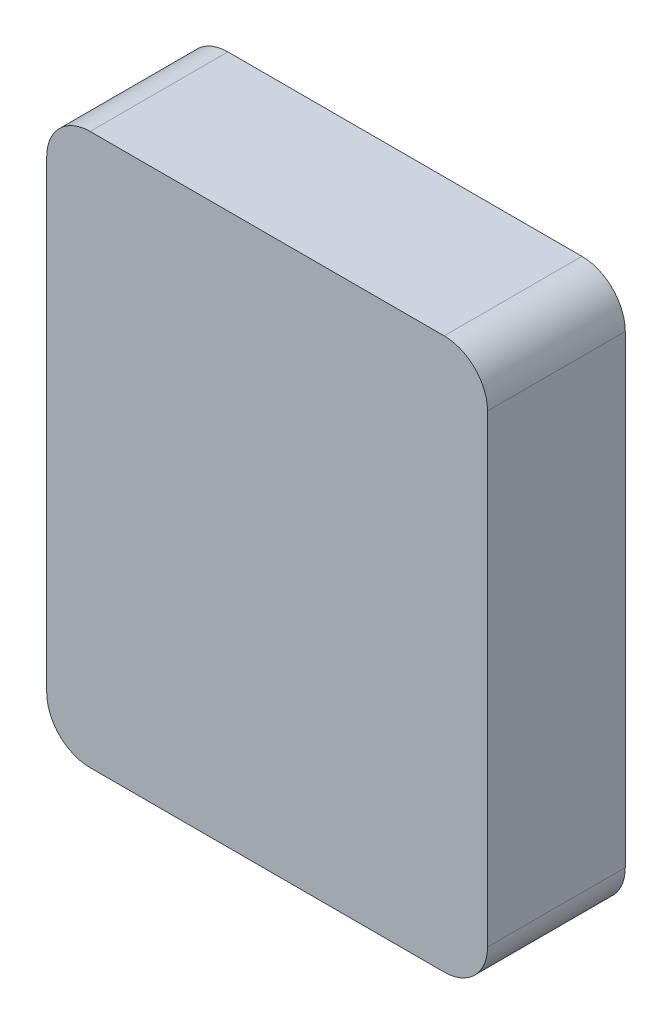
ISO-10303-21;
HEADER;
FILE_DESCRIPTION(('STEP AP214'),'2;1');
FILE_NAME('part.step','',(''),(''),'','','');
FILE_SCHEMA(('AUTOMOTIVE_DESIGN { 1 0 10303 214 1 1 1 1 }'));
ENDSEC;
DATA;
#1=APPLICATION_CONTEXT('core data for automotive mechanical design processes');
#2=APPLICATION_PROTOCOL_DEFINITION('international standard','automotive_design',2000,#1);
#3=PRODUCT_CONTEXT('',#1,'mechanical');
#4=PRODUCT('Part','Part','',(#3));
#5=PRODUCT_RELATED_PRODUCT_CATEGORY('part','',(#4));
#6=PRODUCT_DEFINITION_FORMATION('','',#4);
#7=PRODUCT_DEFINITION_CONTEXT('part definition',#1,'design');
#8=PRODUCT_DEFINITION('design','',#6,#7);
#9=PRODUCT_DEFINITION_SHAPE('','',#8);
#10=(LENGTH_UNIT() NAMED_UNIT(*) SI_UNIT(.MILLI.,.METRE.));
#11=(NAMED_UNIT(*) PLANE_ANGLE_UNIT() SI_UNIT($,.RADIAN.));
#12=(NAMED_UNIT(*) SI_UNIT($,.STERADIAN.) SOLID_ANGLE_UNIT());
#13=UNCERTAINTY_MEASURE_WITH_UNIT(LENGTH_MEASURE(1.E-05),#10,'distance_accuracy_value','');
#14=(GEOMETRIC_REPRESENTATION_CONTEXT(3) GLOBAL_UNCERTAINTY_ASSIGNED_CONTEXT((#13)) GLOBAL_UNIT_ASSIGNED_CONTEXT((#10,
#11,#12)) REPRESENTATION_CONTEXT('',''));
#15=CARTESIAN_POINT('',(0.,0.,0.));
#16=DIRECTION('',(0.,0.,1.));
#17=DIRECTION('',(1.,0.,0.));
#18=AXIS2_PLACEMENT_3D('',#15,#16,#17);
#19=CARTESIAN_POINT('',(0.,0.,31.75));
#20=DIRECTION('',(1.,0.,0.));
#21=DIRECTION('',(0.,0.,-1.));
#22=AXIS2_PLACEMENT_3D('',#19,#20,#21);
#23=PLANE('',#22);
#24=DIRECTION('',(0.,-1.,0.));
#25=VECTOR('',#24,1.);
#26=CARTESIAN_POINT('',(0.,0.,0.));
#27=LINE('',#26,#25);
#28=CARTESIAN_POINT('',(0.,117.,0.));
#29=VERTEX_POINT('',#28);
#30=CARTESIAN_POINT('',(0.,10.,0.));
#31=VERTEX_POINT('',#30);
#32=EDGE_CURVE('E126',#29,#31,#27,.T.);
#33=ORIENTED_EDGE('',*,*,#32,.T.);
#34=DIRECTION('',(0.,0.,-1.));
#35=VECTOR('',#34,1.);
#36=CARTESIAN_POINT('',(0.,10.,31.75));
#37=LINE('',#36,#35);
#38=CARTESIAN_POINT('',(0.,10.,31.75));
#39=VERTEX_POINT('',#38);
#40=EDGE_CURVE('E104',#31,#39,#37,.F.);
#41=ORIENTED_EDGE('',*,*,#40,.T.);
#42=DIRECTION('',(0.,-1.,0.));
#43=VECTOR('',#42,1.);
#44=CARTESIAN_POINT('',(0.,0.,31.75));
#45=LINE('',#44,#43);
#46=CARTESIAN_POINT('',(0.,117.,31.75));
#47=VERTEX_POINT('',#46);
#48=EDGE_CURVE('E135',#47,#39,#45,.T.);
#49=ORIENTED_EDGE('',*,*,#48,.F.);
#50=DIRECTION('',(0.,0.,-1.));
#51=VECTOR('',#50,1.);
#52=CARTESIAN_POINT('',(0.,117.,31.75));
#53=LINE('',#52,#51);
#54=EDGE_CURVE('E109',#47,#29,#53,.T.);
#55=ORIENTED_EDGE('',*,*,#54,.T.);
#56=EDGE_LOOP('',(#33,#41,#49,#55));
#57=FACE_BOUND('',#56,.T.);
#58=ADVANCED_FACE('F33',(#57),#23,.F.);
#59=CARTESIAN_POINT('',(0.,0.,31.75));
#60=DIRECTION('',(0.,1.,0.));
#61=DIRECTION('',(0.,0.,1.));
#62=AXIS2_PLACEMENT_3D('',#59,#60,#61);
#63=PLANE('',#62);
#64=DIRECTION('',(1.,0.,0.));
#65=VECTOR('',#64,1.);
#66=CARTESIAN_POINT('',(0.,0.,31.75));
#67=LINE('',#66,#65);
#68=CARTESIAN_POINT('',(10.,0.,31.75));
#69=VERTEX_POINT('',#68);
#70=CARTESIAN_POINT('',(91.6,0.,31.75));
#71=VERTEX_POINT('',#70);
#72=EDGE_CURVE('E119',#69,#71,#67,.T.);
#73=ORIENTED_EDGE('',*,*,#72,.F.);
#74=DIRECTION('',(0.,0.,-1.));
#75=VECTOR('',#74,1.);
#76=CARTESIAN_POINT('',(10.,0.,31.75));
#77=LINE('',#76,#75);
#78=CARTESIAN_POINT('',(10.,0.,0.));
#79=VERTEX_POINT('',#78);
#80=EDGE_CURVE('E103',#69,#79,#77,.T.);
#81=ORIENTED_EDGE('',*,*,#80,.T.);
#82=DIRECTION('',(1.,0.,0.));
#83=VECTOR('',#82,1.);
#84=CARTESIAN_POINT('',(0.,0.,0.));
#85=LINE('',#84,#83);
#86=CARTESIAN_POINT('',(91.6,0.,0.));
#87=VERTEX_POINT('',#86);
#88=EDGE_CURVE('E116',#79,#87,#85,.T.);
#89=ORIENTED_EDGE('',*,*,#88,.T.);
#90=DIRECTION('',(0.,0.,-1.));
#91=VECTOR('',#90,1.);
#92=CARTESIAN_POINT('',(91.6,0.,31.75));
#93=LINE('',#92,#91);
#94=EDGE_CURVE('E121',#87,#71,#93,.F.);
#95=ORIENTED_EDGE('',*,*,#94,.T.);
#96=EDGE_LOOP('',(#73,#81,#89,#95));
#97=FACE_BOUND('',#96,.T.);
#98=ADVANCED_FACE('F115',(#97),#63,.F.);
#99=CARTESIAN_POINT('',(101.6,0.,31.75));
#100=DIRECTION('',(-1.,0.,0.));
#101=DIRECTION('',(0.,0.,1.));
#102=AXIS2_PLACEMENT_3D('',#99,#100,#101);
#103=PLANE('',#102);
#104=DIRECTION('',(0.,1.,0.));
#105=VECTOR('',#104,1.);
#106=CARTESIAN_POINT('',(101.6,0.,31.75));
#107=LINE('',#106,#105);
#108=CARTESIAN_POINT('',(101.6,10.,31.75));
#109=VERTEX_POINT('',#108);
#110=CARTESIAN_POINT('',(101.6,117.,31.75));
#111=VERTEX_POINT('',#110);
#112=EDGE_CURVE('E161',#109,#111,#107,.T.);
#113=ORIENTED_EDGE('',*,*,#112,.F.);
#114=DIRECTION('',(0.,0.,-1.));
#115=VECTOR('',#114,1.);
#116=CARTESIAN_POINT('',(101.6,10.,31.75));
#117=LINE('',#116,#115);
#118=CARTESIAN_POINT('',(101.6,10.,0.));
#119=VERTEX_POINT('',#118);
#120=EDGE_CURVE('E154',#109,#119,#117,.T.);
#121=ORIENTED_EDGE('',*,*,#120,.T.);
#122=DIRECTION('',(0.,1.,0.));
#123=VECTOR('',#122,1.);
#124=CARTESIAN_POINT('',(101.6,0.,0.));
#125=LINE('',#124,#123);
#126=CARTESIAN_POINT('',(101.6,117.,0.));
#127=VERTEX_POINT('',#126);
#128=EDGE_CURVE('E125',#119,#127,#125,.T.);
#129=ORIENTED_EDGE('',*,*,#128,.T.);
#130=DIRECTION('',(0.,0.,-1.));
#131=VECTOR('',#130,1.);
#132=CARTESIAN_POINT('',(101.6,117.,31.75));
#133=LINE('',#132,#131);
#134=EDGE_CURVE('E152',#127,#111,#133,.F.);
#135=ORIENTED_EDGE('',*,*,#134,.T.);
#136=EDGE_LOOP('',(#113,#121,#129,#135));
#137=FACE_BOUND('',#136,.T.);
#138=ADVANCED_FACE('F159',(#137),#103,.F.);
#139=CARTESIAN_POINT('',(0.,127.,31.75));
#140=DIRECTION('',(0.,-1.,0.));
#141=DIRECTION('',(0.,0.,-1.));
#142=AXIS2_PLACEMENT_3D('',#139,#140,#141);
#143=PLANE('',#142);
#144=DIRECTION('',(-1.,0.,0.));
#145=VECTOR('',#144,1.);
#146=CARTESIAN_POINT('',(0.,127.,31.75));
#147=LINE('',#146,#145);
#148=CARTESIAN_POINT('',(91.6,127.,31.75));
#149=VERTEX_POINT('',#148);
#150=CARTESIAN_POINT('',(10.,127.,31.75));
#151=VERTEX_POINT('',#150);
#152=EDGE_CURVE('E136',#149,#151,#147,.T.);
#153=ORIENTED_EDGE('',*,*,#152,.F.);
#154=DIRECTION('',(0.,0.,-1.));
#155=VECTOR('',#154,1.);
#156=CARTESIAN_POINT('',(91.6,127.,31.75));
#157=LINE('',#156,#155);
#158=CARTESIAN_POINT('',(91.6,127.,0.));
#159=VERTEX_POINT('',#158);
#160=EDGE_CURVE('E11',#149,#159,#157,.T.);
#161=ORIENTED_EDGE('',*,*,#160,.T.);
#162=DIRECTION('',(-1.,0.,0.));
#163=VECTOR('',#162,1.);
#164=CARTESIAN_POINT('',(0.,127.,0.));
#165=LINE('',#164,#163);
#166=CARTESIAN_POINT('',(10.,127.,0.));
#167=VERTEX_POINT('',#166);
#168=EDGE_CURVE('E129',#159,#167,#165,.T.);
#169=ORIENTED_EDGE('',*,*,#168,.T.);
#170=DIRECTION('',(0.,0.,-1.));
#171=VECTOR('',#170,1.);
#172=CARTESIAN_POINT('',(10.,127.,31.75));
#173=LINE('',#172,#171);
#174=EDGE_CURVE('E41',#167,#151,#173,.F.);
#175=ORIENTED_EDGE('',*,*,#174,.T.);
#176=EDGE_LOOP('',(#153,#161,#169,#175));
#177=FACE_BOUND('',#176,.T.);
#178=ADVANCED_FACE('F168',(#177),#143,.F.);
#179=CARTESIAN_POINT('',(0.,0.,31.75));
#180=DIRECTION('',(0.,0.,-1.));
#181=DIRECTION('',(-1.,0.,0.));
#182=AXIS2_PLACEMENT_3D('',#179,#180,#181);
#183=PLANE('',#182);
#184=ORIENTED_EDGE('',*,*,#48,.T.);
#185=CARTESIAN_POINT('',(10.,10.,31.75));
#186=DIRECTION('',(0.,0.,-1.));
#187=DIRECTION('',(-1.,0.,0.));
#188=AXIS2_PLACEMENT_3D('',#185,#186,#187);
#189=CIRCLE('',#188,10.);
#190=EDGE_CURVE('E150',#39,#69,#189,.F.);
#191=ORIENTED_EDGE('',*,*,#190,.T.);
#192=ORIENTED_EDGE('',*,*,#72,.T.);
#193=CARTESIAN_POINT('',(91.6,10.,31.75));
#194=DIRECTION('',(0.,0.,-1.));
#195=DIRECTION('',(-1.,0.,0.));
#196=AXIS2_PLACEMENT_3D('',#193,#194,#195);
#197=CIRCLE('',#196,10.);
#198=EDGE_CURVE('E148',#71,#109,#197,.F.);
#199=ORIENTED_EDGE('',*,*,#198,.T.);
#200=ORIENTED_EDGE('',*,*,#112,.T.);
#201=CARTESIAN_POINT('',(91.6,117.,31.75));
#202=DIRECTION('',(0.,0.,-1.));
#203=DIRECTION('',(-1.,0.,0.));
#204=AXIS2_PLACEMENT_3D('',#201,#202,#203);
#205=CIRCLE('',#204,10.);
#206=EDGE_CURVE('E54',#111,#149,#205,.F.);
#207=ORIENTED_EDGE('',*,*,#206,.T.);
#208=ORIENTED_EDGE('',*,*,#152,.T.);
#209=CARTESIAN_POINT('',(10.,117.,31.75));
#210=DIRECTION('',(0.,0.,-1.));
#211=DIRECTION('',(-1.,0.,0.));
#212=AXIS2_PLACEMENT_3D('',#209,#210,#211);
#213=CIRCLE('',#212,10.);
#214=EDGE_CURVE('E145',#151,#47,#213,.F.);
#215=ORIENTED_EDGE('',*,*,#214,.T.);
#216=EDGE_LOOP('',(#184,#191,#192,#199,#200,#207,#208,#215));
#217=FACE_BOUND('',#216,.T.);
#218=ADVANCED_FACE('F175',(#217),#183,.F.);
#219=CARTESIAN_POINT('',(0.,0.,0.));
#220=DIRECTION('',(0.,0.,-1.));
#221=DIRECTION('',(-1.,0.,0.));
#222=AXIS2_PLACEMENT_3D('',#219,#220,#221);
#223=PLANE('',#222);
#224=ORIENTED_EDGE('',*,*,#88,.F.);
#225=CARTESIAN_POINT('',(10.,10.,0.));
#226=DIRECTION('',(0.,0.,-1.));
#227=DIRECTION('',(-1.,0.,0.));
#228=AXIS2_PLACEMENT_3D('',#225,#226,#227);
#229=CIRCLE('',#228,10.);
#230=EDGE_CURVE('E99',#79,#31,#229,.T.);
#231=ORIENTED_EDGE('',*,*,#230,.T.);
#232=ORIENTED_EDGE('',*,*,#32,.F.);
#233=CARTESIAN_POINT('',(10.,117.,0.));
#234=DIRECTION('',(0.,0.,-1.));
#235=DIRECTION('',(-1.,0.,0.));
#236=AXIS2_PLACEMENT_3D('',#233,#234,#235);
#237=CIRCLE('',#236,10.);
#238=EDGE_CURVE('E120',#29,#167,#237,.T.);
#239=ORIENTED_EDGE('',*,*,#238,.T.);
#240=ORIENTED_EDGE('',*,*,#168,.F.);
#241=CARTESIAN_POINT('',(91.6,117.,0.));
#242=DIRECTION('',(0.,0.,-1.));
#243=DIRECTION('',(-1.,0.,0.));
#244=AXIS2_PLACEMENT_3D('',#241,#242,#243);
#245=CIRCLE('',#244,10.);
#246=EDGE_CURVE('E139',#159,#127,#245,.T.);
#247=ORIENTED_EDGE('',*,*,#246,.T.);
#248=ORIENTED_EDGE('',*,*,#128,.F.);
#249=CARTESIAN_POINT('',(91.6,10.,0.));
#250=DIRECTION('',(0.,0.,-1.));
#251=DIRECTION('',(-1.,0.,0.));
#252=AXIS2_PLACEMENT_3D('',#249,#250,#251);
#253=CIRCLE('',#252,10.);
#254=EDGE_CURVE('E110',#119,#87,#253,.T.);
#255=ORIENTED_EDGE('',*,*,#254,.T.);
#256=EDGE_LOOP('',(#224,#231,#232,#239,#240,#247,#248,#255));
#257=FACE_BOUND('',#256,.T.);
#258=ADVANCED_FACE('F123',(#257),#223,.T.);
#259=CARTESIAN_POINT('',(10.,10.,31.75));
#260=DIRECTION('',(0.,0.,-1.));
#261=DIRECTION('',(-1.,0.,0.));
#262=AXIS2_PLACEMENT_3D('',#259,#260,#261);
#263=CYLINDRICAL_SURFACE('',#262,10.);
#264=ORIENTED_EDGE('',*,*,#190,.F.);
#265=ORIENTED_EDGE('',*,*,#40,.F.);
#266=ORIENTED_EDGE('',*,*,#230,.F.);
#267=ORIENTED_EDGE('',*,*,#80,.F.);
#268=EDGE_LOOP('',(#264,#265,#266,#267));
#269=FACE_BOUND('',#268,.T.);
#270=ADVANCED_FACE('F102',(#269),#263,.T.);
#271=CARTESIAN_POINT('',(91.6,10.,31.75));
#272=DIRECTION('',(0.,0.,-1.));
#273=DIRECTION('',(-1.,0.,0.));
#274=AXIS2_PLACEMENT_3D('',#271,#272,#273);
#275=CYLINDRICAL_SURFACE('',#274,10.);
#276=ORIENTED_EDGE('',*,*,#198,.F.);
#277=ORIENTED_EDGE('',*,*,#94,.F.);
#278=ORIENTED_EDGE('',*,*,#254,.F.);
#279=ORIENTED_EDGE('',*,*,#120,.F.);
#280=EDGE_LOOP('',(#276,#277,#278,#279));
#281=FACE_BOUND('',#280,.T.);
#282=ADVANCED_FACE('F183',(#281),#275,.T.);
#283=CARTESIAN_POINT('',(91.6,117.,31.75));
#284=DIRECTION('',(0.,0.,-1.));
#285=DIRECTION('',(-1.,0.,0.));
#286=AXIS2_PLACEMENT_3D('',#283,#284,#285);
#287=CYLINDRICAL_SURFACE('',#286,10.);
#288=ORIENTED_EDGE('',*,*,#206,.F.);
#289=ORIENTED_EDGE('',*,*,#134,.F.);
#290=ORIENTED_EDGE('',*,*,#246,.F.);
#291=ORIENTED_EDGE('',*,*,#160,.F.);
#292=EDGE_LOOP('',(#288,#289,#290,#291));
#293=FACE_BOUND('',#292,.T.);
#294=ADVANCED_FACE('F167',(#293),#287,.T.);
#295=CARTESIAN_POINT('',(10.,117.,31.75));
#296=DIRECTION('',(0.,0.,-1.));
#297=DIRECTION('',(-1.,0.,0.));
#298=AXIS2_PLACEMENT_3D('',#295,#296,#297);
#299=CYLINDRICAL_SURFACE('',#298,10.);
#300=ORIENTED_EDGE('',*,*,#214,.F.);
#301=ORIENTED_EDGE('',*,*,#174,.F.);
#302=ORIENTED_EDGE('',*,*,#238,.F.);
#303=ORIENTED_EDGE('',*,*,#54,.F.);
#304=EDGE_LOOP('',(#300,#301,#302,#303));
#305=FACE_BOUND('',#304,.T.);
#306=ADVANCED_FACE('F35',(#305),#299,.T.);
#307=CLOSED_SHELL('',(#58,#98,#138,#178,#218,#258,#270,#282,#294,#306));
#308=MANIFOLD_SOLID_BREP('B2',#307);
#309=ADVANCED_BREP_SHAPE_REPRESENTATION('',(#18,#308),#14);
#310=SHAPE_DEFINITION_REPRESENTATION(#9,#309);
ENDSEC;
END-ISO-10303-21;
